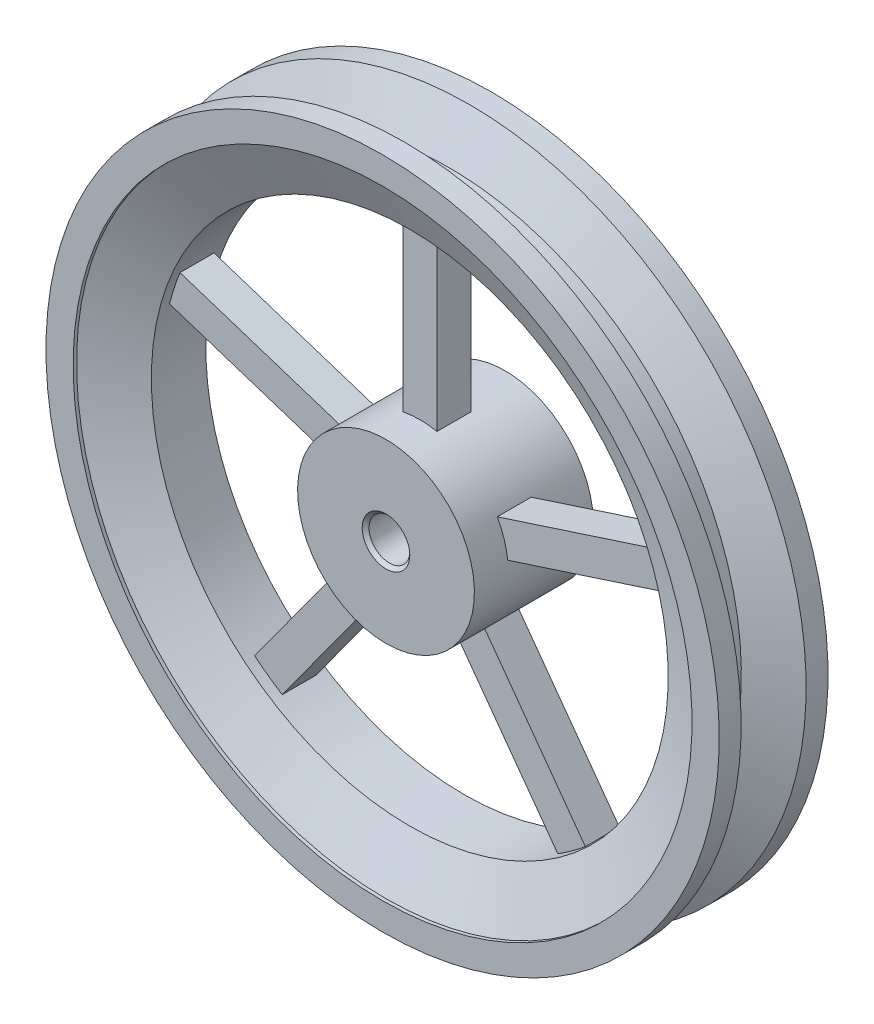
ISO-10303-21;
HEADER;
FILE_DESCRIPTION(('STEP AP214'),'2;1');
FILE_NAME('part.step','',(''),(''),'','','');
FILE_SCHEMA(('AUTOMOTIVE_DESIGN { 1 0 10303 214 1 1 1 1 }'));
ENDSEC;
DATA;
#1=APPLICATION_CONTEXT('core data for automotive mechanical design processes');
#2=APPLICATION_PROTOCOL_DEFINITION('international standard','automotive_design',2000,#1);
#3=PRODUCT_CONTEXT('',#1,'mechanical');
#4=PRODUCT('Part','Part','',(#3));
#5=PRODUCT_RELATED_PRODUCT_CATEGORY('part','',(#4));
#6=PRODUCT_DEFINITION_FORMATION('','',#4);
#7=PRODUCT_DEFINITION_CONTEXT('part definition',#1,'design');
#8=PRODUCT_DEFINITION('design','',#6,#7);
#9=PRODUCT_DEFINITION_SHAPE('','',#8);
#10=(LENGTH_UNIT() NAMED_UNIT(*) SI_UNIT(.MILLI.,.METRE.));
#11=(NAMED_UNIT(*) PLANE_ANGLE_UNIT() SI_UNIT($,.RADIAN.));
#12=(NAMED_UNIT(*) SI_UNIT($,.STERADIAN.) SOLID_ANGLE_UNIT());
#13=UNCERTAINTY_MEASURE_WITH_UNIT(LENGTH_MEASURE(1.E-05),#10,'distance_accuracy_value','');
#14=(GEOMETRIC_REPRESENTATION_CONTEXT(3) GLOBAL_UNCERTAINTY_ASSIGNED_CONTEXT((#13)) GLOBAL_UNIT_ASSIGNED_CONTEXT((#10,
#11,#12)) REPRESENTATION_CONTEXT('',''));
#15=CARTESIAN_POINT('',(0.,0.,0.));
#16=DIRECTION('',(0.,0.,1.));
#17=DIRECTION('',(1.,0.,0.));
#18=AXIS2_PLACEMENT_3D('',#15,#16,#17);
#19=CARTESIAN_POINT('',(0.,140.,10.));
#20=DIRECTION('',(0.,0.,-1.));
#21=DIRECTION('',(0.,1.,0.));
#22=AXIS2_PLACEMENT_3D('',#19,#20,#21);
#23=PLANE('',#22);
#24=DIRECTION('',(0.,1.,0.));
#25=VECTOR('',#24,1.);
#26=CARTESIAN_POINT('',(-10.0000000000001,0.,10.));
#27=LINE('',#26,#25);
#28=CARTESIAN_POINT('',(-10.0000000000001,39.0294032886923,10.));
#29=VERTEX_POINT('',#28);
#30=CARTESIAN_POINT('',(-10.0000000000001,139.670695917174,10.));
#31=VERTEX_POINT('',#30);
#32=EDGE_CURVE('E355',#29,#31,#27,.T.);
#33=ORIENTED_EDGE('',*,*,#32,.F.);
#34=CARTESIAN_POINT('',(0.,-12.,10.));
#35=DIRECTION('',(0.,0.,1.));
#36=DIRECTION('',(0.,-1.,0.));
#37=AXIS2_PLACEMENT_3D('',#34,#35,#36);
#38=CIRCLE('',#37,52.);
#39=CARTESIAN_POINT('',(9.99999999999993,39.0294032886923,10.));
#40=VERTEX_POINT('',#39);
#41=EDGE_CURVE('E344',#40,#29,#38,.T.);
#42=ORIENTED_EDGE('',*,*,#41,.F.);
#43=DIRECTION('',(0.,1.,0.));
#44=VECTOR('',#43,1.);
#45=CARTESIAN_POINT('',(9.99999999999993,0.,10.));
#46=LINE('',#45,#44);
#47=CARTESIAN_POINT('',(9.99999999999993,139.670695917174,9.99999999999999));
#48=VERTEX_POINT('',#47);
#49=EDGE_CURVE('E369',#40,#48,#46,.T.);
#50=ORIENTED_EDGE('',*,*,#49,.T.);
#51=CARTESIAN_POINT('',(0.,-12.,9.99999999999999));
#52=DIRECTION('',(0.,0.,1.));
#53=DIRECTION('',(0.,-1.,0.));
#54=AXIS2_PLACEMENT_3D('',#51,#52,#53);
#55=CIRCLE('',#54,152.);
#56=EDGE_CURVE('E572',#48,#31,#55,.T.);
#57=ORIENTED_EDGE('',*,*,#56,.T.);
#58=EDGE_LOOP('',(#33,#42,#50,#57));
#59=FACE_BOUND('',#58,.T.);
#60=ADVANCED_FACE('F139',(#59),#23,.F.);
#61=DIRECTION('',(0.951056516295154,0.309016994374945,0.));
#62=VECTOR('',#61,1.);
#63=CARTESIAN_POINT('',(0.436541570005119,-1.34353680329741,10.));
#64=LINE('',#63,#62);
#65=CARTESIAN_POINT('',(45.4416765766144,13.2795179919709,10.));
#66=VERTEX_POINT('',#65);
#67=CARTESIAN_POINT('',(141.1572337393,44.3793877500338,10.));
#68=VERTEX_POINT('',#67);
#69=EDGE_CURVE('E372',#66,#68,#64,.T.);
#70=ORIENTED_EDGE('',*,*,#69,.F.);
#71=CARTESIAN_POINT('',(51.6220164641136,-5.74161233393213,10.));
#72=VERTEX_POINT('',#71);
#73=EDGE_CURVE('E412',#72,#66,#38,.T.);
#74=ORIENTED_EDGE('',*,*,#73,.F.);
#75=DIRECTION('',(0.951056516295155,0.309016994374945,0.));
#76=VECTOR('',#75,1.);
#77=CARTESIAN_POINT('',(6.61688145750401,-20.3646671292005,10.));
#78=LINE('',#77,#76);
#79=CARTESIAN_POINT('',(147.337573626799,25.3582574241307,9.99999999999999));
#80=VERTEX_POINT('',#79);
#81=EDGE_CURVE('E513',#72,#80,#78,.T.);
#82=ORIENTED_EDGE('',*,*,#81,.T.);
#83=EDGE_CURVE('E573',#80,#68,#55,.T.);
#84=ORIENTED_EDGE('',*,*,#83,.T.);
#85=EDGE_LOOP('',(#70,#74,#82,#84));
#86=FACE_BOUND('',#85,.T.);
#87=ADVANCED_FACE('F467',(#86),#23,.F.);
#88=DIRECTION('',(-0.58778525229248,-0.809016994374942,0.));
#89=VECTOR('',#88,1.);
#90=CARTESIAN_POINT('',(13.7965090415227,-10.0237505566769,10.));
#91=LINE('',#90,#89);
#92=CARTESIAN_POINT('',(-21.9041607426266,-59.1615069962907,10.));
#93=VERTEX_POINT('',#92);
#94=CARTESIAN_POINT('',(-81.0596283213006,-140.582023068595,10.));
#95=VERTEX_POINT('',#94);
#96=EDGE_CURVE('E503',#93,#95,#91,.T.);
#97=ORIENTED_EDGE('',*,*,#96,.F.);
#98=CARTESIAN_POINT('',(-38.0845006301262,-47.405801950442,10.));
#99=VERTEX_POINT('',#98);
#100=EDGE_CURVE('E285',#99,#93,#38,.T.);
#101=ORIENTED_EDGE('',*,*,#100,.F.);
#102=DIRECTION('',(-0.58778525229248,-0.809016994374942,0.));
#103=VECTOR('',#102,1.);
#104=CARTESIAN_POINT('',(-2.38383084597611,1.73195448917268,10.));
#105=LINE('',#104,#103);
#106=CARTESIAN_POINT('',(-97.2399682087997,-128.826318022745,9.99999999999999));
#107=VERTEX_POINT('',#106);
#108=EDGE_CURVE('E385',#99,#107,#105,.T.);
#109=ORIENTED_EDGE('',*,*,#108,.T.);
#110=EDGE_CURVE('E567',#107,#95,#55,.T.);
#111=ORIENTED_EDGE('',*,*,#110,.T.);
#112=EDGE_LOOP('',(#97,#101,#109,#111));
#113=FACE_BOUND('',#112,.T.);
#114=ADVANCED_FACE('F473',(#113),#23,.F.);
#115=CARTESIAN_POINT('',(21.904160742631,-59.1615069962887,10.));
#116=VERTEX_POINT('',#115);
#117=CARTESIAN_POINT('',(38.0845006301294,-47.4058019504385,10.));
#118=VERTEX_POINT('',#117);
#119=EDGE_CURVE('E414',#116,#118,#38,.T.);
#120=ORIENTED_EDGE('',*,*,#119,.F.);
#121=DIRECTION('',(0.587785252292469,-0.809016994374951,0.));
#122=VECTOR('',#121,1.);
#123=CARTESIAN_POINT('',(-13.7965090415184,-10.0237505566734,10.));
#124=LINE('',#123,#122);
#125=CARTESIAN_POINT('',(81.0596283213033,-140.582023068593,9.99999999999999));
#126=VERTEX_POINT('',#125);
#127=EDGE_CURVE('E298',#116,#126,#124,.T.);
#128=ORIENTED_EDGE('',*,*,#127,.T.);
#129=CARTESIAN_POINT('',(97.2399682088022,-128.826318022743,10.));
#130=VERTEX_POINT('',#129);
#131=EDGE_CURVE('E413',#126,#130,#55,.T.);
#132=ORIENTED_EDGE('',*,*,#131,.T.);
#133=DIRECTION('',(0.587785252292469,-0.809016994374951,0.));
#134=VECTOR('',#133,1.);
#135=CARTESIAN_POINT('',(2.38383084598065,1.73195448917592,10.));
#136=LINE('',#135,#134);
#137=EDGE_CURVE('E494',#118,#130,#136,.T.);
#138=ORIENTED_EDGE('',*,*,#137,.F.);
#139=EDGE_LOOP('',(#120,#128,#132,#138));
#140=FACE_BOUND('',#139,.T.);
#141=ADVANCED_FACE('F476',(#140),#23,.F.);
#142=CARTESIAN_POINT('',(-45.4416765766151,13.2795179919696,10.));
#143=VERTEX_POINT('',#142);
#144=CARTESIAN_POINT('',(-51.6220164641137,-5.74161233393359,10.));
#145=VERTEX_POINT('',#144);
#146=EDGE_CURVE('E406',#143,#145,#38,.T.);
#147=ORIENTED_EDGE('',*,*,#146,.F.);
#148=DIRECTION('',(-0.95105651629515,0.309016994374958,0.));
#149=VECTOR('',#148,1.);
#150=CARTESIAN_POINT('',(-0.436541570005793,-1.34353680329942,10.));
#151=LINE('',#150,#149);
#152=CARTESIAN_POINT('',(-141.1572337393,44.3793877500337,10.));
#153=VERTEX_POINT('',#152);
#154=EDGE_CURVE('E359',#143,#153,#151,.T.);
#155=ORIENTED_EDGE('',*,*,#154,.T.);
#156=CARTESIAN_POINT('',(-147.337573626799,25.3582574241307,10.));
#157=VERTEX_POINT('',#156);
#158=EDGE_CURVE('E408',#153,#157,#55,.T.);
#159=ORIENTED_EDGE('',*,*,#158,.T.);
#160=DIRECTION('',(-0.95105651629515,0.309016994374958,0.));
#161=VECTOR('',#160,1.);
#162=CARTESIAN_POINT('',(-6.61688145750496,-20.3646671292024,10.));
#163=LINE('',#162,#161);
#164=EDGE_CURVE('E365',#145,#157,#163,.T.);
#165=ORIENTED_EDGE('',*,*,#164,.F.);
#166=EDGE_LOOP('',(#147,#155,#159,#165));
#167=FACE_BOUND('',#166,.T.);
#168=ADVANCED_FACE('F405',(#167),#23,.F.);
#169=CARTESIAN_POINT('',(0.,140.,-10.));
#170=DIRECTION('',(0.,0.,1.));
#171=DIRECTION('',(0.,-1.,0.));
#172=AXIS2_PLACEMENT_3D('',#169,#170,#171);
#173=PLANE('',#172);
#174=DIRECTION('',(-0.95105651629515,0.309016994374958,0.));
#175=VECTOR('',#174,1.);
#176=CARTESIAN_POINT('',(-0.436541570005793,-1.34353680329942,-10.));
#177=LINE('',#176,#175);
#178=CARTESIAN_POINT('',(-45.4416765766151,13.2795179919696,-10.));
#179=VERTEX_POINT('',#178);
#180=CARTESIAN_POINT('',(-141.1572337393,44.3793877500337,-10.));
#181=VERTEX_POINT('',#180);
#182=EDGE_CURVE('E352',#179,#181,#177,.T.);
#183=ORIENTED_EDGE('',*,*,#182,.F.);
#184=CARTESIAN_POINT('',(0.,-12.,-10.));
#185=DIRECTION('',(0.,0.,1.));
#186=DIRECTION('',(0.,-1.,0.));
#187=AXIS2_PLACEMENT_3D('',#184,#185,#186);
#188=CIRCLE('',#187,52.);
#189=CARTESIAN_POINT('',(-51.6220164641137,-5.74161233393359,-10.));
#190=VERTEX_POINT('',#189);
#191=EDGE_CURVE('E303',#179,#190,#188,.T.);
#192=ORIENTED_EDGE('',*,*,#191,.T.);
#193=DIRECTION('',(-0.95105651629515,0.309016994374958,0.));
#194=VECTOR('',#193,1.);
#195=CARTESIAN_POINT('',(-6.61688145750496,-20.3646671292024,-10.));
#196=LINE('',#195,#194);
#197=CARTESIAN_POINT('',(-147.337573626799,25.3582574241307,-10.));
#198=VERTEX_POINT('',#197);
#199=EDGE_CURVE('E382',#190,#198,#196,.T.);
#200=ORIENTED_EDGE('',*,*,#199,.T.);
#201=CARTESIAN_POINT('',(0.,-12.,-10.));
#202=DIRECTION('',(0.,0.,1.));
#203=DIRECTION('',(0.,-1.,0.));
#204=AXIS2_PLACEMENT_3D('',#201,#202,#203);
#205=CIRCLE('',#204,152.);
#206=EDGE_CURVE('E320',#181,#198,#205,.T.);
#207=ORIENTED_EDGE('',*,*,#206,.F.);
#208=EDGE_LOOP('',(#183,#192,#200,#207));
#209=FACE_BOUND('',#208,.T.);
#210=ADVANCED_FACE('F464',(#209),#173,.F.);
#211=CARTESIAN_POINT('',(9.99999999999993,39.0294032886923,-10.));
#212=VERTEX_POINT('',#211);
#213=CARTESIAN_POINT('',(-10.0000000000001,39.0294032886923,-10.));
#214=VERTEX_POINT('',#213);
#215=EDGE_CURVE('E308',#212,#214,#188,.T.);
#216=ORIENTED_EDGE('',*,*,#215,.T.);
#217=DIRECTION('',(0.,1.,0.));
#218=VECTOR('',#217,1.);
#219=CARTESIAN_POINT('',(-10.0000000000001,0.,-10.));
#220=LINE('',#219,#218);
#221=CARTESIAN_POINT('',(-10.0000000000001,139.670695917174,-10.));
#222=VERTEX_POINT('',#221);
#223=EDGE_CURVE('E335',#214,#222,#220,.T.);
#224=ORIENTED_EDGE('',*,*,#223,.T.);
#225=CARTESIAN_POINT('',(9.99999999999993,139.670695917174,-10.));
#226=VERTEX_POINT('',#225);
#227=EDGE_CURVE('E535',#226,#222,#205,.T.);
#228=ORIENTED_EDGE('',*,*,#227,.F.);
#229=DIRECTION('',(0.,1.,0.));
#230=VECTOR('',#229,1.);
#231=CARTESIAN_POINT('',(9.99999999999993,0.,-10.));
#232=LINE('',#231,#230);
#233=EDGE_CURVE('E337',#212,#226,#232,.T.);
#234=ORIENTED_EDGE('',*,*,#233,.F.);
#235=EDGE_LOOP('',(#216,#224,#228,#234));
#236=FACE_BOUND('',#235,.T.);
#237=ADVANCED_FACE('F332',(#236),#173,.F.);
#238=DIRECTION('',(0.587785252292469,-0.809016994374951,0.));
#239=VECTOR('',#238,1.);
#240=CARTESIAN_POINT('',(-13.7965090415184,-10.0237505566734,-10.));
#241=LINE('',#240,#239);
#242=CARTESIAN_POINT('',(21.904160742631,-59.1615069962887,-10.));
#243=VERTEX_POINT('',#242);
#244=CARTESIAN_POINT('',(81.0596283213033,-140.582023068593,-10.));
#245=VERTEX_POINT('',#244);
#246=EDGE_CURVE('E290',#243,#245,#241,.T.);
#247=ORIENTED_EDGE('',*,*,#246,.F.);
#248=CARTESIAN_POINT('',(38.0845006301294,-47.4058019504385,-10.));
#249=VERTEX_POINT('',#248);
#250=EDGE_CURVE('E306',#243,#249,#188,.T.);
#251=ORIENTED_EDGE('',*,*,#250,.T.);
#252=DIRECTION('',(0.587785252292469,-0.809016994374951,0.));
#253=VECTOR('',#252,1.);
#254=CARTESIAN_POINT('',(2.38383084598065,1.73195448917592,-10.));
#255=LINE('',#254,#253);
#256=CARTESIAN_POINT('',(97.2399682088022,-128.826318022743,-10.));
#257=VERTEX_POINT('',#256);
#258=EDGE_CURVE('E510',#249,#257,#255,.T.);
#259=ORIENTED_EDGE('',*,*,#258,.T.);
#260=EDGE_CURVE('E321',#245,#257,#205,.T.);
#261=ORIENTED_EDGE('',*,*,#260,.F.);
#262=EDGE_LOOP('',(#247,#251,#259,#261));
#263=FACE_BOUND('',#262,.T.);
#264=ADVANCED_FACE('F526',(#263),#173,.F.);
#265=CARTESIAN_POINT('',(51.6220164641136,-5.74161233393213,-10.));
#266=VERTEX_POINT('',#265);
#267=CARTESIAN_POINT('',(45.4416765766144,13.2795179919709,-10.));
#268=VERTEX_POINT('',#267);
#269=EDGE_CURVE('E315',#266,#268,#188,.T.);
#270=ORIENTED_EDGE('',*,*,#269,.T.);
#271=DIRECTION('',(0.951056516295154,0.309016994374945,0.));
#272=VECTOR('',#271,1.);
#273=CARTESIAN_POINT('',(0.436541570005119,-1.34353680329741,-10.));
#274=LINE('',#273,#272);
#275=CARTESIAN_POINT('',(141.1572337393,44.3793877500338,-10.));
#276=VERTEX_POINT('',#275);
#277=EDGE_CURVE('E367',#268,#276,#274,.T.);
#278=ORIENTED_EDGE('',*,*,#277,.T.);
#279=CARTESIAN_POINT('',(147.337573626799,25.3582574241307,-10.));
#280=VERTEX_POINT('',#279);
#281=EDGE_CURVE('E530',#280,#276,#205,.T.);
#282=ORIENTED_EDGE('',*,*,#281,.F.);
#283=DIRECTION('',(0.951056516295155,0.309016994374945,0.));
#284=VECTOR('',#283,1.);
#285=CARTESIAN_POINT('',(6.61688145750401,-20.3646671292005,-10.));
#286=LINE('',#285,#284);
#287=EDGE_CURVE('E512',#266,#280,#286,.T.);
#288=ORIENTED_EDGE('',*,*,#287,.F.);
#289=EDGE_LOOP('',(#270,#278,#282,#288));
#290=FACE_BOUND('',#289,.T.);
#291=ADVANCED_FACE('F462',(#290),#173,.F.);
#292=CARTESIAN_POINT('',(-38.0845006301262,-47.405801950442,-10.));
#293=VERTEX_POINT('',#292);
#294=CARTESIAN_POINT('',(-21.9041607426266,-59.1615069962907,-10.));
#295=VERTEX_POINT('',#294);
#296=EDGE_CURVE('E283',#293,#295,#188,.T.);
#297=ORIENTED_EDGE('',*,*,#296,.T.);
#298=DIRECTION('',(-0.58778525229248,-0.809016994374942,0.));
#299=VECTOR('',#298,1.);
#300=CARTESIAN_POINT('',(13.7965090415227,-10.0237505566769,-10.));
#301=LINE('',#300,#299);
#302=CARTESIAN_POINT('',(-81.0596283213006,-140.582023068595,-10.));
#303=VERTEX_POINT('',#302);
#304=EDGE_CURVE('E293',#295,#303,#301,.T.);
#305=ORIENTED_EDGE('',*,*,#304,.T.);
#306=CARTESIAN_POINT('',(-97.2399682087997,-128.826318022745,-10.));
#307=VERTEX_POINT('',#306);
#308=EDGE_CURVE('E314',#307,#303,#205,.T.);
#309=ORIENTED_EDGE('',*,*,#308,.F.);
#310=DIRECTION('',(-0.58778525229248,-0.809016994374942,0.));
#311=VECTOR('',#310,1.);
#312=CARTESIAN_POINT('',(-2.38383084597611,1.73195448917268,-10.));
#313=LINE('',#312,#311);
#314=EDGE_CURVE('E302',#293,#307,#313,.T.);
#315=ORIENTED_EDGE('',*,*,#314,.F.);
#316=EDGE_LOOP('',(#297,#305,#309,#315));
#317=FACE_BOUND('',#316,.T.);
#318=ADVANCED_FACE('F301',(#317),#173,.F.);
#319=CARTESIAN_POINT('',(0.,40.,30.));
#320=DIRECTION('',(0.,0.,-1.));
#321=DIRECTION('',(0.,1.,0.));
#322=AXIS2_PLACEMENT_3D('',#319,#320,#321);
#323=PLANE('',#322);
#324=CARTESIAN_POINT('',(0.,-12.,30.));
#325=DIRECTION('',(0.,0.,-1.));
#326=DIRECTION('',(0.,1.,0.));
#327=AXIS2_PLACEMENT_3D('',#324,#325,#326);
#328=CIRCLE('',#327,13.9999999999999);
#329=CARTESIAN_POINT('',(0.,1.99999999999988,30.));
#330=VERTEX_POINT('',#329);
#331=EDGE_CURVE('E12',#330,#330,#328,.T.);
#332=ORIENTED_EDGE('',*,*,#331,.T.);
#333=EDGE_LOOP('',(#332));
#334=FACE_BOUND('',#333,.T.);
#335=CARTESIAN_POINT('',(0.,-12.,30.));
#336=DIRECTION('',(0.,0.,1.));
#337=DIRECTION('',(0.,-1.,0.));
#338=AXIS2_PLACEMENT_3D('',#335,#336,#337);
#339=CIRCLE('',#338,52.);
#340=CARTESIAN_POINT('',(0.,-64.,30.));
#341=VERTEX_POINT('',#340);
#342=EDGE_CURVE('E418',#341,#341,#339,.T.);
#343=ORIENTED_EDGE('',*,*,#342,.T.);
#344=EDGE_LOOP('',(#343));
#345=FACE_BOUND('',#344,.T.);
#346=ADVANCED_FACE('F449',(#334,#345),#323,.F.);
#347=CARTESIAN_POINT('',(0.,-12.,30.));
#348=DIRECTION('',(0.,0.,1.));
#349=DIRECTION('',(0.,-1.,0.));
#350=AXIS2_PLACEMENT_3D('',#347,#348,#349);
#351=CONICAL_SURFACE('',#350,182.,1.13446401379631);
#352=CARTESIAN_POINT('',(0.,-12.,16.01077025535));
#353=DIRECTION('',(0.,0.,1.));
#354=DIRECTION('',(0.,-1.,0.));
#355=AXIS2_PLACEMENT_3D('',#352,#353,#354);
#356=CIRCLE('',#355,152.);
#357=CARTESIAN_POINT('',(0.,-164.,16.01077025535));
#358=VERTEX_POINT('',#357);
#359=EDGE_CURVE('E565',#358,#358,#356,.T.);
#360=ORIENTED_EDGE('',*,*,#359,.F.);
#361=EDGE_LOOP('',(#360));
#362=FACE_BOUND('',#361,.T.);
#363=CARTESIAN_POINT('',(0.,-12.,30.));
#364=DIRECTION('',(0.,0.,1.));
#365=DIRECTION('',(0.,-1.,0.));
#366=AXIS2_PLACEMENT_3D('',#363,#364,#365);
#367=CIRCLE('',#366,182.);
#368=CARTESIAN_POINT('',(0.,-194.,30.));
#369=VERTEX_POINT('',#368);
#370=EDGE_CURVE('E563',#369,#369,#367,.T.);
#371=ORIENTED_EDGE('',*,*,#370,.T.);
#372=EDGE_LOOP('',(#371));
#373=FACE_BOUND('',#372,.T.);
#374=ADVANCED_FACE('F451',(#362,#373),#351,.F.);
#375=CARTESIAN_POINT('',(0.,-12.,30.));
#376=DIRECTION('',(0.,0.,1.));
#377=DIRECTION('',(0.,-1.,0.));
#378=AXIS2_PLACEMENT_3D('',#375,#376,#377);
#379=CYLINDRICAL_SURFACE('',#378,182.);
#380=ORIENTED_EDGE('',*,*,#370,.F.);
#381=EDGE_LOOP('',(#380));
#382=FACE_BOUND('',#381,.T.);
#383=CARTESIAN_POINT('',(0.,-12.,32.));
#384=DIRECTION('',(0.,0.,1.));
#385=DIRECTION('',(0.,-1.,0.));
#386=AXIS2_PLACEMENT_3D('',#383,#384,#385);
#387=CIRCLE('',#386,182.);
#388=CARTESIAN_POINT('',(0.,-194.,32.));
#389=VERTEX_POINT('',#388);
#390=EDGE_CURVE('E560',#389,#389,#387,.T.);
#391=ORIENTED_EDGE('',*,*,#390,.T.);
#392=EDGE_LOOP('',(#391));
#393=FACE_BOUND('',#392,.T.);
#394=ADVANCED_FACE('F458',(#382,#393),#379,.F.);
#395=CARTESIAN_POINT('',(0.,186.,32.));
#396=DIRECTION('',(0.,0.,-1.));
#397=DIRECTION('',(0.,1.,0.));
#398=AXIS2_PLACEMENT_3D('',#395,#396,#397);
#399=PLANE('',#398);
#400=ORIENTED_EDGE('',*,*,#390,.F.);
#401=EDGE_LOOP('',(#400));
#402=FACE_BOUND('',#401,.T.);
#403=CARTESIAN_POINT('',(0.,-12.,32.));
#404=DIRECTION('',(0.,0.,1.));
#405=DIRECTION('',(0.,-1.,0.));
#406=AXIS2_PLACEMENT_3D('',#403,#404,#405);
#407=CIRCLE('',#406,198.);
#408=CARTESIAN_POINT('',(0.,-210.,32.));
#409=VERTEX_POINT('',#408);
#410=EDGE_CURVE('E557',#409,#409,#407,.T.);
#411=ORIENTED_EDGE('',*,*,#410,.T.);
#412=EDGE_LOOP('',(#411));
#413=FACE_BOUND('',#412,.T.);
#414=ADVANCED_FACE('F641',(#402,#413),#399,.F.);
#415=CARTESIAN_POINT('',(0.,-12.,30.));
#416=DIRECTION('',(0.,0.,1.));
#417=DIRECTION('',(0.,-1.,0.));
#418=AXIS2_PLACEMENT_3D('',#415,#416,#417);
#419=CYLINDRICAL_SURFACE('',#418,198.);
#420=ORIENTED_EDGE('',*,*,#410,.F.);
#421=EDGE_LOOP('',(#420));
#422=FACE_BOUND('',#421,.T.);
#423=CARTESIAN_POINT('',(0.,-12.,19.1239991120299));
#424=DIRECTION('',(0.,0.,1.));
#425=DIRECTION('',(0.,-1.,0.));
#426=AXIS2_PLACEMENT_3D('',#423,#424,#425);
#427=CIRCLE('',#426,198.);
#428=CARTESIAN_POINT('',(0.,-210.,19.1239991120299));
#429=VERTEX_POINT('',#428);
#430=EDGE_CURVE('E554',#429,#429,#427,.T.);
#431=ORIENTED_EDGE('',*,*,#430,.T.);
#432=EDGE_LOOP('',(#431));
#433=FACE_BOUND('',#432,.T.);
#434=ADVANCED_FACE('F637',(#422,#433),#419,.T.);
#435=CARTESIAN_POINT('',(0.,-12.,6.99999999999998));
#436=DIRECTION('',(0.,0.,1.));
#437=DIRECTION('',(0.,-1.,0.));
#438=AXIS2_PLACEMENT_3D('',#435,#436,#437);
#439=CONICAL_SURFACE('',#438,172.,1.13446401379631);
#440=ORIENTED_EDGE('',*,*,#430,.F.);
#441=EDGE_LOOP('',(#440));
#442=FACE_BOUND('',#441,.T.);
#443=CARTESIAN_POINT('',(0.,-12.,6.99999999999998));
#444=DIRECTION('',(0.,0.,1.));
#445=DIRECTION('',(0.,-1.,0.));
#446=AXIS2_PLACEMENT_3D('',#443,#444,#445);
#447=CIRCLE('',#446,172.);
#448=CARTESIAN_POINT('',(0.,-184.,6.99999999999996));
#449=VERTEX_POINT('',#448);
#450=EDGE_CURVE('E551',#449,#449,#447,.T.);
#451=ORIENTED_EDGE('',*,*,#450,.T.);
#452=EDGE_LOOP('',(#451));
#453=FACE_BOUND('',#452,.T.);
#454=ADVANCED_FACE('F633',(#442,#453),#439,.T.);
#455=CARTESIAN_POINT('',(0.,-12.,30.));
#456=DIRECTION('',(0.,0.,1.));
#457=DIRECTION('',(0.,-1.,0.));
#458=AXIS2_PLACEMENT_3D('',#455,#456,#457);
#459=CYLINDRICAL_SURFACE('',#458,172.);
#460=ORIENTED_EDGE('',*,*,#450,.F.);
#461=EDGE_LOOP('',(#460));
#462=FACE_BOUND('',#461,.T.);
#463=CARTESIAN_POINT('',(0.,-12.,-7.00000000000001));
#464=DIRECTION('',(0.,0.,1.));
#465=DIRECTION('',(0.,-1.,0.));
#466=AXIS2_PLACEMENT_3D('',#463,#464,#465);
#467=CIRCLE('',#466,172.);
#468=CARTESIAN_POINT('',(0.,-184.,-7.00000000000003));
#469=VERTEX_POINT('',#468);
#470=EDGE_CURVE('E548',#469,#469,#467,.T.);
#471=ORIENTED_EDGE('',*,*,#470,.T.);
#472=EDGE_LOOP('',(#471));
#473=FACE_BOUND('',#472,.T.);
#474=ADVANCED_FACE('F629',(#462,#473),#459,.T.);
#475=CARTESIAN_POINT('',(0.,-12.,-19.12399911203));
#476=DIRECTION('',(0.,0.,-1.));
#477=DIRECTION('',(0.,1.,0.));
#478=AXIS2_PLACEMENT_3D('',#475,#476,#477);
#479=CONICAL_SURFACE('',#478,198.,1.13446401379631);
#480=ORIENTED_EDGE('',*,*,#470,.F.);
#481=EDGE_LOOP('',(#480));
#482=FACE_BOUND('',#481,.T.);
#483=CARTESIAN_POINT('',(0.,-12.,-19.12399911203));
#484=DIRECTION('',(0.,0.,1.));
#485=DIRECTION('',(0.,-1.,0.));
#486=AXIS2_PLACEMENT_3D('',#483,#484,#485);
#487=CIRCLE('',#486,198.);
#488=CARTESIAN_POINT('',(0.,-210.,-19.12399911203));
#489=VERTEX_POINT('',#488);
#490=EDGE_CURVE('E545',#489,#489,#487,.T.);
#491=ORIENTED_EDGE('',*,*,#490,.T.);
#492=EDGE_LOOP('',(#491));
#493=FACE_BOUND('',#492,.T.);
#494=ADVANCED_FACE('F625',(#482,#493),#479,.T.);
#495=CARTESIAN_POINT('',(0.,-12.,30.));
#496=DIRECTION('',(0.,0.,1.));
#497=DIRECTION('',(0.,-1.,0.));
#498=AXIS2_PLACEMENT_3D('',#495,#496,#497);
#499=CYLINDRICAL_SURFACE('',#498,198.);
#500=ORIENTED_EDGE('',*,*,#490,.F.);
#501=EDGE_LOOP('',(#500));
#502=FACE_BOUND('',#501,.T.);
#503=CARTESIAN_POINT('',(0.,-12.,-32.));
#504=DIRECTION('',(0.,0.,1.));
#505=DIRECTION('',(0.,-1.,0.));
#506=AXIS2_PLACEMENT_3D('',#503,#504,#505);
#507=CIRCLE('',#506,198.);
#508=CARTESIAN_POINT('',(0.,-210.,-32.));
#509=VERTEX_POINT('',#508);
#510=EDGE_CURVE('E542',#509,#509,#507,.T.);
#511=ORIENTED_EDGE('',*,*,#510,.T.);
#512=EDGE_LOOP('',(#511));
#513=FACE_BOUND('',#512,.T.);
#514=ADVANCED_FACE('F621',(#502,#513),#499,.T.);
#515=CARTESIAN_POINT('',(0.,186.,-32.));
#516=DIRECTION('',(0.,0.,1.));
#517=DIRECTION('',(0.,-1.,0.));
#518=AXIS2_PLACEMENT_3D('',#515,#516,#517);
#519=PLANE('',#518);
#520=ORIENTED_EDGE('',*,*,#510,.F.);
#521=EDGE_LOOP('',(#520));
#522=FACE_BOUND('',#521,.T.);
#523=CARTESIAN_POINT('',(0.,-12.,-32.));
#524=DIRECTION('',(0.,0.,1.));
#525=DIRECTION('',(0.,-1.,0.));
#526=AXIS2_PLACEMENT_3D('',#523,#524,#525);
#527=CIRCLE('',#526,182.);
#528=CARTESIAN_POINT('',(0.,-194.,-32.));
#529=VERTEX_POINT('',#528);
#530=EDGE_CURVE('E539',#529,#529,#527,.T.);
#531=ORIENTED_EDGE('',*,*,#530,.T.);
#532=EDGE_LOOP('',(#531));
#533=FACE_BOUND('',#532,.T.);
#534=ADVANCED_FACE('F617',(#522,#533),#519,.F.);
#535=CARTESIAN_POINT('',(0.,-12.,30.));
#536=DIRECTION('',(0.,0.,1.));
#537=DIRECTION('',(0.,-1.,0.));
#538=AXIS2_PLACEMENT_3D('',#535,#536,#537);
#539=CYLINDRICAL_SURFACE('',#538,182.);
#540=ORIENTED_EDGE('',*,*,#530,.F.);
#541=EDGE_LOOP('',(#540));
#542=FACE_BOUND('',#541,.T.);
#543=CARTESIAN_POINT('',(0.,-12.,-30.));
#544=DIRECTION('',(0.,0.,1.));
#545=DIRECTION('',(0.,-1.,0.));
#546=AXIS2_PLACEMENT_3D('',#543,#544,#545);
#547=CIRCLE('',#546,182.);
#548=CARTESIAN_POINT('',(0.,-194.,-30.));
#549=VERTEX_POINT('',#548);
#550=EDGE_CURVE('E532',#549,#549,#547,.T.);
#551=ORIENTED_EDGE('',*,*,#550,.T.);
#552=EDGE_LOOP('',(#551));
#553=FACE_BOUND('',#552,.T.);
#554=ADVANCED_FACE('F613',(#542,#553),#539,.F.);
#555=CARTESIAN_POINT('',(0.,-12.,-16.0107702553501));
#556=DIRECTION('',(0.,0.,-1.));
#557=DIRECTION('',(0.,1.,0.));
#558=AXIS2_PLACEMENT_3D('',#555,#556,#557);
#559=CONICAL_SURFACE('',#558,152.,1.13446401379631);
#560=ORIENTED_EDGE('',*,*,#550,.F.);
#561=EDGE_LOOP('',(#560));
#562=FACE_BOUND('',#561,.T.);
#563=CARTESIAN_POINT('',(0.,-12.,-16.0107702553501));
#564=DIRECTION('',(0.,0.,1.));
#565=DIRECTION('',(0.,-1.,0.));
#566=AXIS2_PLACEMENT_3D('',#563,#564,#565);
#567=CIRCLE('',#566,152.);
#568=CARTESIAN_POINT('',(0.,-164.,-16.0107702553501));
#569=VERTEX_POINT('',#568);
#570=EDGE_CURVE('E529',#569,#569,#567,.T.);
#571=ORIENTED_EDGE('',*,*,#570,.T.);
#572=EDGE_LOOP('',(#571));
#573=FACE_BOUND('',#572,.T.);
#574=ADVANCED_FACE('F611',(#562,#573),#559,.F.);
#575=CARTESIAN_POINT('',(0.,-12.,30.));
#576=DIRECTION('',(0.,0.,1.));
#577=DIRECTION('',(0.,-1.,0.));
#578=AXIS2_PLACEMENT_3D('',#575,#576,#577);
#579=CYLINDRICAL_SURFACE('',#578,152.);
#580=ORIENTED_EDGE('',*,*,#158,.F.);
#581=DIRECTION('',(0.,0.,1.));
#582=VECTOR('',#581,1.);
#583=CARTESIAN_POINT('',(-141.1572337393,44.3793877500337,-10.));
#584=LINE('',#583,#582);
#585=EDGE_CURVE('E363',#181,#153,#584,.T.);
#586=ORIENTED_EDGE('',*,*,#585,.F.);
#587=ORIENTED_EDGE('',*,*,#206,.T.);
#588=DIRECTION('',(0.,0.,1.));
#589=VECTOR('',#588,1.);
#590=CARTESIAN_POINT('',(-147.337573626799,25.3582574241307,-10.));
#591=LINE('',#590,#589);
#592=EDGE_CURVE('E393',#198,#157,#591,.T.);
#593=ORIENTED_EDGE('',*,*,#592,.T.);
#594=EDGE_LOOP('',(#580,#586,#587,#593));
#595=FACE_BOUND('',#594,.T.);
#596=ORIENTED_EDGE('',*,*,#56,.F.);
#597=DIRECTION('',(0.,0.,1.));
#598=VECTOR('',#597,1.);
#599=CARTESIAN_POINT('',(9.99999999999993,139.670695917174,-10.));
#600=LINE('',#599,#598);
#601=EDGE_CURVE('E162',#226,#48,#600,.T.);
#602=ORIENTED_EDGE('',*,*,#601,.F.);
#603=ORIENTED_EDGE('',*,*,#227,.T.);
#604=DIRECTION('',(0.,0.,1.));
#605=VECTOR('',#604,1.);
#606=CARTESIAN_POINT('',(-10.0000000000001,139.670695917174,-10.));
#607=LINE('',#606,#605);
#608=EDGE_CURVE('E348',#222,#31,#607,.T.);
#609=ORIENTED_EDGE('',*,*,#608,.T.);
#610=EDGE_LOOP('',(#596,#602,#603,#609));
#611=FACE_BOUND('',#610,.T.);
#612=ORIENTED_EDGE('',*,*,#131,.F.);
#613=DIRECTION('',(0.,0.,1.));
#614=VECTOR('',#613,1.);
#615=CARTESIAN_POINT('',(81.0596283213033,-140.582023068593,-10.));
#616=LINE('',#615,#614);
#617=EDGE_CURVE('E499',#245,#126,#616,.T.);
#618=ORIENTED_EDGE('',*,*,#617,.F.);
#619=ORIENTED_EDGE('',*,*,#260,.T.);
#620=DIRECTION('',(0.,0.,1.));
#621=VECTOR('',#620,1.);
#622=CARTESIAN_POINT('',(97.2399682088022,-128.826318022743,-10.));
#623=LINE('',#622,#621);
#624=EDGE_CURVE('E521',#257,#130,#623,.T.);
#625=ORIENTED_EDGE('',*,*,#624,.T.);
#626=EDGE_LOOP('',(#612,#618,#619,#625));
#627=FACE_BOUND('',#626,.T.);
#628=ORIENTED_EDGE('',*,*,#83,.F.);
#629=DIRECTION('',(0.,0.,1.));
#630=VECTOR('',#629,1.);
#631=CARTESIAN_POINT('',(147.337573626799,25.3582574241307,-10.));
#632=LINE('',#631,#630);
#633=EDGE_CURVE('E519',#280,#80,#632,.T.);
#634=ORIENTED_EDGE('',*,*,#633,.F.);
#635=ORIENTED_EDGE('',*,*,#281,.T.);
#636=DIRECTION('',(0.,0.,1.));
#637=VECTOR('',#636,1.);
#638=CARTESIAN_POINT('',(141.1572337393,44.3793877500338,-10.));
#639=LINE('',#638,#637);
#640=EDGE_CURVE('E379',#276,#68,#639,.T.);
#641=ORIENTED_EDGE('',*,*,#640,.T.);
#642=EDGE_LOOP('',(#628,#634,#635,#641));
#643=FACE_BOUND('',#642,.T.);
#644=ORIENTED_EDGE('',*,*,#570,.F.);
#645=EDGE_LOOP('',(#644));
#646=FACE_BOUND('',#645,.T.);
#647=DIRECTION('',(0.,0.,1.));
#648=VECTOR('',#647,1.);
#649=CARTESIAN_POINT('',(-81.0596283213006,-140.582023068595,-10.));
#650=LINE('',#649,#648);
#651=EDGE_CURVE('E289',#303,#95,#650,.T.);
#652=ORIENTED_EDGE('',*,*,#651,.T.);
#653=ORIENTED_EDGE('',*,*,#110,.F.);
#654=DIRECTION('',(0.,0.,1.));
#655=VECTOR('',#654,1.);
#656=CARTESIAN_POINT('',(-97.2399682087997,-128.826318022745,-10.));
#657=LINE('',#656,#655);
#658=EDGE_CURVE('E154',#307,#107,#657,.T.);
#659=ORIENTED_EDGE('',*,*,#658,.F.);
#660=ORIENTED_EDGE('',*,*,#308,.T.);
#661=EDGE_LOOP('',(#652,#653,#659,#660));
#662=FACE_BOUND('',#661,.T.);
#663=ORIENTED_EDGE('',*,*,#359,.T.);
#664=EDGE_LOOP('',(#663));
#665=FACE_BOUND('',#664,.T.);
#666=ADVANCED_FACE('F445',(#595,#611,#627,#643,#646,#662,#665),#579,.F.);
#667=CARTESIAN_POINT('',(0.,-12.,30.));
#668=DIRECTION('',(0.,0.,1.));
#669=DIRECTION('',(0.,-1.,0.));
#670=AXIS2_PLACEMENT_3D('',#667,#668,#669);
#671=CYLINDRICAL_SURFACE('',#670,52.);
#672=ORIENTED_EDGE('',*,*,#41,.T.);
#673=DIRECTION('',(0.,0.,1.));
#674=VECTOR('',#673,1.);
#675=CARTESIAN_POINT('',(-10.0000000000001,39.0294032886923,-10.));
#676=LINE('',#675,#674);
#677=EDGE_CURVE('E342',#214,#29,#676,.T.);
#678=ORIENTED_EDGE('',*,*,#677,.F.);
#679=ORIENTED_EDGE('',*,*,#215,.F.);
#680=DIRECTION('',(0.,0.,1.));
#681=VECTOR('',#680,1.);
#682=CARTESIAN_POINT('',(9.99999999999993,39.0294032886923,-10.));
#683=LINE('',#682,#681);
#684=EDGE_CURVE('E341',#212,#40,#683,.T.);
#685=ORIENTED_EDGE('',*,*,#684,.T.);
#686=EDGE_LOOP('',(#672,#678,#679,#685));
#687=FACE_BOUND('',#686,.T.);
#688=ORIENTED_EDGE('',*,*,#73,.T.);
#689=DIRECTION('',(0.,0.,1.));
#690=VECTOR('',#689,1.);
#691=CARTESIAN_POINT('',(45.4416765766144,13.2795179919709,-10.));
#692=LINE('',#691,#690);
#693=EDGE_CURVE('E371',#268,#66,#692,.T.);
#694=ORIENTED_EDGE('',*,*,#693,.F.);
#695=ORIENTED_EDGE('',*,*,#269,.F.);
#696=DIRECTION('',(0.,0.,1.));
#697=VECTOR('',#696,1.);
#698=CARTESIAN_POINT('',(51.6220164641136,-5.74161233393213,-10.));
#699=LINE('',#698,#697);
#700=EDGE_CURVE('E375',#266,#72,#699,.T.);
#701=ORIENTED_EDGE('',*,*,#700,.T.);
#702=EDGE_LOOP('',(#688,#694,#695,#701));
#703=FACE_BOUND('',#702,.T.);
#704=ORIENTED_EDGE('',*,*,#100,.T.);
#705=DIRECTION('',(0.,0.,1.));
#706=VECTOR('',#705,1.);
#707=CARTESIAN_POINT('',(-21.9041607426266,-59.1615069962907,-10.));
#708=LINE('',#707,#706);
#709=EDGE_CURVE('E278',#295,#93,#708,.T.);
#710=ORIENTED_EDGE('',*,*,#709,.F.);
#711=ORIENTED_EDGE('',*,*,#296,.F.);
#712=DIRECTION('',(0.,0.,1.));
#713=VECTOR('',#712,1.);
#714=CARTESIAN_POINT('',(-38.0845006301262,-47.405801950442,-10.));
#715=LINE('',#714,#713);
#716=EDGE_CURVE('E310',#293,#99,#715,.T.);
#717=ORIENTED_EDGE('',*,*,#716,.T.);
#718=EDGE_LOOP('',(#704,#710,#711,#717));
#719=FACE_BOUND('',#718,.T.);
#720=ORIENTED_EDGE('',*,*,#119,.T.);
#721=DIRECTION('',(0.,0.,1.));
#722=VECTOR('',#721,1.);
#723=CARTESIAN_POINT('',(38.0845006301294,-47.4058019504385,-10.));
#724=LINE('',#723,#722);
#725=EDGE_CURVE('E495',#249,#118,#724,.T.);
#726=ORIENTED_EDGE('',*,*,#725,.F.);
#727=ORIENTED_EDGE('',*,*,#250,.F.);
#728=DIRECTION('',(0.,0.,1.));
#729=VECTOR('',#728,1.);
#730=CARTESIAN_POINT('',(21.904160742631,-59.1615069962887,-10.));
#731=LINE('',#730,#729);
#732=EDGE_CURVE('E497',#243,#116,#731,.T.);
#733=ORIENTED_EDGE('',*,*,#732,.T.);
#734=EDGE_LOOP('',(#720,#726,#727,#733));
#735=FACE_BOUND('',#734,.T.);
#736=DIRECTION('',(0.,0.,1.));
#737=VECTOR('',#736,1.);
#738=CARTESIAN_POINT('',(-45.4416765766151,13.2795179919696,-10.));
#739=LINE('',#738,#737);
#740=EDGE_CURVE('E349',#179,#143,#739,.T.);
#741=ORIENTED_EDGE('',*,*,#740,.T.);
#742=ORIENTED_EDGE('',*,*,#146,.T.);
#743=DIRECTION('',(0.,0.,1.));
#744=VECTOR('',#743,1.);
#745=CARTESIAN_POINT('',(-51.6220164641137,-5.74161233393359,-10.));
#746=LINE('',#745,#744);
#747=EDGE_CURVE('E387',#190,#145,#746,.T.);
#748=ORIENTED_EDGE('',*,*,#747,.F.);
#749=ORIENTED_EDGE('',*,*,#191,.F.);
#750=EDGE_LOOP('',(#741,#742,#748,#749));
#751=FACE_BOUND('',#750,.T.);
#752=CARTESIAN_POINT('',(0.,-12.,-40.));
#753=DIRECTION('',(0.,0.,1.));
#754=DIRECTION('',(0.,-1.,0.));
#755=AXIS2_PLACEMENT_3D('',#752,#753,#754);
#756=CIRCLE('',#755,52.);
#757=CARTESIAN_POINT('',(0.,-64.,-40.));
#758=VERTEX_POINT('',#757);
#759=EDGE_CURVE('E304',#758,#758,#756,.T.);
#760=ORIENTED_EDGE('',*,*,#759,.T.);
#761=EDGE_LOOP('',(#760));
#762=FACE_BOUND('',#761,.T.);
#763=ORIENTED_EDGE('',*,*,#342,.F.);
#764=EDGE_LOOP('',(#763));
#765=FACE_BOUND('',#764,.T.);
#766=ADVANCED_FACE('F280',(#687,#703,#719,#735,#751,#762,#765),#671,.T.);
#767=CARTESIAN_POINT('',(0.,40.,-40.));
#768=DIRECTION('',(0.,0.,1.));
#769=DIRECTION('',(0.,-1.,0.));
#770=AXIS2_PLACEMENT_3D('',#767,#768,#769);
#771=PLANE('',#770);
#772=CARTESIAN_POINT('',(0.,-12.,-40.));
#773=DIRECTION('',(0.,0.,1.));
#774=DIRECTION('',(0.,-1.,0.));
#775=AXIS2_PLACEMENT_3D('',#772,#773,#774);
#776=CIRCLE('',#775,14.);
#777=CARTESIAN_POINT('',(0.,-26.,-40.));
#778=VERTEX_POINT('',#777);
#779=EDGE_CURVE('E422',#778,#778,#776,.T.);
#780=ORIENTED_EDGE('',*,*,#779,.T.);
#781=EDGE_LOOP('',(#780));
#782=FACE_BOUND('',#781,.T.);
#783=ORIENTED_EDGE('',*,*,#759,.F.);
#784=EDGE_LOOP('',(#783));
#785=FACE_BOUND('',#784,.T.);
#786=ADVANCED_FACE('F438',(#782,#785),#771,.F.);
#787=CARTESIAN_POINT('',(0.,-12.,30.));
#788=DIRECTION('',(0.,0.,1.));
#789=DIRECTION('',(0.,-1.,0.));
#790=AXIS2_PLACEMENT_3D('',#787,#788,#789);
#791=CYLINDRICAL_SURFACE('',#790,12.);
#792=CARTESIAN_POINT('',(0.,-12.,-38.));
#793=DIRECTION('',(0.,0.,1.));
#794=DIRECTION('',(1.,0.,0.));
#795=AXIS2_PLACEMENT_3D('',#792,#793,#794);
#796=CIRCLE('',#795,12.);
#797=CARTESIAN_POINT('',(12.,-12.,-38.));
#798=VERTEX_POINT('',#797);
#799=EDGE_CURVE('E147',#798,#798,#796,.F.);
#800=ORIENTED_EDGE('',*,*,#799,.T.);
#801=EDGE_LOOP('',(#800));
#802=FACE_BOUND('',#801,.T.);
#803=CARTESIAN_POINT('',(0.,-12.,28.0000000000001));
#804=DIRECTION('',(0.,0.,-1.));
#805=DIRECTION('',(-1.,0.,0.));
#806=AXIS2_PLACEMENT_3D('',#803,#804,#805);
#807=CIRCLE('',#806,12.);
#808=CARTESIAN_POINT('',(-12.,-12.,28.0000000000001));
#809=VERTEX_POINT('',#808);
#810=EDGE_CURVE('E425',#809,#809,#807,.F.);
#811=ORIENTED_EDGE('',*,*,#810,.T.);
#812=EDGE_LOOP('',(#811));
#813=FACE_BOUND('',#812,.T.);
#814=ADVANCED_FACE('F430',(#802,#813),#791,.F.);
#815=CARTESIAN_POINT('',(-2.38383084597611,1.73195448917268,-10.));
#816=DIRECTION('',(-0.809016994374942,0.58778525229248,0.));
#817=DIRECTION('',(-0.58778525229248,-0.809016994374942,0.));
#818=AXIS2_PLACEMENT_3D('',#815,#816,#817);
#819=PLANE('',#818);
#820=ORIENTED_EDGE('',*,*,#108,.F.);
#821=ORIENTED_EDGE('',*,*,#716,.F.);
#822=ORIENTED_EDGE('',*,*,#314,.T.);
#823=ORIENTED_EDGE('',*,*,#658,.T.);
#824=EDGE_LOOP('',(#820,#821,#822,#823));
#825=FACE_BOUND('',#824,.T.);
#826=ADVANCED_FACE('F601',(#825),#819,.T.);
#827=CARTESIAN_POINT('',(-6.61688145750496,-20.3646671292024,-10.));
#828=DIRECTION('',(0.309016994374958,0.95105651629515,0.));
#829=DIRECTION('',(-0.95105651629515,0.309016994374958,0.));
#830=AXIS2_PLACEMENT_3D('',#827,#828,#829);
#831=PLANE('',#830);
#832=ORIENTED_EDGE('',*,*,#164,.T.);
#833=ORIENTED_EDGE('',*,*,#592,.F.);
#834=ORIENTED_EDGE('',*,*,#199,.F.);
#835=ORIENTED_EDGE('',*,*,#747,.T.);
#836=EDGE_LOOP('',(#832,#833,#834,#835));
#837=FACE_BOUND('',#836,.T.);
#838=ADVANCED_FACE('F398',(#837),#831,.F.);
#839=CARTESIAN_POINT('',(6.61688145750401,-20.3646671292005,-10.));
#840=DIRECTION('',(0.309016994374945,-0.951056516295155,0.));
#841=DIRECTION('',(0.951056516295155,0.309016994374945,0.));
#842=AXIS2_PLACEMENT_3D('',#839,#840,#841);
#843=PLANE('',#842);
#844=ORIENTED_EDGE('',*,*,#81,.F.);
#845=ORIENTED_EDGE('',*,*,#700,.F.);
#846=ORIENTED_EDGE('',*,*,#287,.T.);
#847=ORIENTED_EDGE('',*,*,#633,.T.);
#848=EDGE_LOOP('',(#844,#845,#846,#847));
#849=FACE_BOUND('',#848,.T.);
#850=ADVANCED_FACE('F606',(#849),#843,.T.);
#851=CARTESIAN_POINT('',(2.38383084598065,1.73195448917592,-10.));
#852=DIRECTION('',(-0.809016994374951,-0.587785252292469,0.));
#853=DIRECTION('',(0.587785252292469,-0.809016994374951,0.));
#854=AXIS2_PLACEMENT_3D('',#851,#852,#853);
#855=PLANE('',#854);
#856=ORIENTED_EDGE('',*,*,#137,.T.);
#857=ORIENTED_EDGE('',*,*,#624,.F.);
#858=ORIENTED_EDGE('',*,*,#258,.F.);
#859=ORIENTED_EDGE('',*,*,#725,.T.);
#860=EDGE_LOOP('',(#856,#857,#858,#859));
#861=FACE_BOUND('',#860,.T.);
#862=ADVANCED_FACE('F523',(#861),#855,.F.);
#863=CARTESIAN_POINT('',(-13.7965090415184,-10.0237505566734,-10.));
#864=DIRECTION('',(-0.809016994374951,-0.587785252292469,0.));
#865=DIRECTION('',(0.587785252292469,-0.809016994374951,0.));
#866=AXIS2_PLACEMENT_3D('',#863,#864,#865);
#867=PLANE('',#866);
#868=ORIENTED_EDGE('',*,*,#127,.F.);
#869=ORIENTED_EDGE('',*,*,#732,.F.);
#870=ORIENTED_EDGE('',*,*,#246,.T.);
#871=ORIENTED_EDGE('',*,*,#617,.T.);
#872=EDGE_LOOP('',(#868,#869,#870,#871));
#873=FACE_BOUND('',#872,.T.);
#874=ADVANCED_FACE('F501',(#873),#867,.T.);
#875=CARTESIAN_POINT('',(13.7965090415227,-10.0237505566769,-10.));
#876=DIRECTION('',(-0.809016994374942,0.58778525229248,0.));
#877=DIRECTION('',(-0.58778525229248,-0.809016994374942,0.));
#878=AXIS2_PLACEMENT_3D('',#875,#876,#877);
#879=PLANE('',#878);
#880=ORIENTED_EDGE('',*,*,#96,.T.);
#881=ORIENTED_EDGE('',*,*,#651,.F.);
#882=ORIENTED_EDGE('',*,*,#304,.F.);
#883=ORIENTED_EDGE('',*,*,#709,.T.);
#884=EDGE_LOOP('',(#880,#881,#882,#883));
#885=FACE_BOUND('',#884,.T.);
#886=ADVANCED_FACE('F294',(#885),#879,.F.);
#887=CARTESIAN_POINT('',(9.99999999999993,0.,-10.));
#888=DIRECTION('',(1.,0.,0.));
#889=DIRECTION('',(0.,0.,-1.));
#890=AXIS2_PLACEMENT_3D('',#887,#888,#889);
#891=PLANE('',#890);
#892=ORIENTED_EDGE('',*,*,#49,.F.);
#893=ORIENTED_EDGE('',*,*,#684,.F.);
#894=ORIENTED_EDGE('',*,*,#233,.T.);
#895=ORIENTED_EDGE('',*,*,#601,.T.);
#896=EDGE_LOOP('',(#892,#893,#894,#895));
#897=FACE_BOUND('',#896,.T.);
#898=ADVANCED_FACE('F594',(#897),#891,.T.);
#899=CARTESIAN_POINT('',(0.436541570005119,-1.34353680329741,-10.));
#900=DIRECTION('',(0.309016994374945,-0.951056516295155,0.));
#901=DIRECTION('',(0.951056516295155,0.309016994374945,0.));
#902=AXIS2_PLACEMENT_3D('',#899,#900,#901);
#903=PLANE('',#902);
#904=ORIENTED_EDGE('',*,*,#69,.T.);
#905=ORIENTED_EDGE('',*,*,#640,.F.);
#906=ORIENTED_EDGE('',*,*,#277,.F.);
#907=ORIENTED_EDGE('',*,*,#693,.T.);
#908=EDGE_LOOP('',(#904,#905,#906,#907));
#909=FACE_BOUND('',#908,.T.);
#910=ADVANCED_FACE('F588',(#909),#903,.F.);
#911=CARTESIAN_POINT('',(-0.436541570005793,-1.34353680329942,-10.));
#912=DIRECTION('',(0.309016994374958,0.95105651629515,0.));
#913=DIRECTION('',(-0.95105651629515,0.309016994374958,0.));
#914=AXIS2_PLACEMENT_3D('',#911,#912,#913);
#915=PLANE('',#914);
#916=ORIENTED_EDGE('',*,*,#154,.F.);
#917=ORIENTED_EDGE('',*,*,#740,.F.);
#918=ORIENTED_EDGE('',*,*,#182,.T.);
#919=ORIENTED_EDGE('',*,*,#585,.T.);
#920=EDGE_LOOP('',(#916,#917,#918,#919));
#921=FACE_BOUND('',#920,.T.);
#922=ADVANCED_FACE('F586',(#921),#915,.T.);
#923=CARTESIAN_POINT('',(-10.0000000000001,0.,-10.));
#924=DIRECTION('',(1.,0.,0.));
#925=DIRECTION('',(0.,0.,-1.));
#926=AXIS2_PLACEMENT_3D('',#923,#924,#925);
#927=PLANE('',#926);
#928=ORIENTED_EDGE('',*,*,#32,.T.);
#929=ORIENTED_EDGE('',*,*,#608,.F.);
#930=ORIENTED_EDGE('',*,*,#223,.F.);
#931=ORIENTED_EDGE('',*,*,#677,.T.);
#932=EDGE_LOOP('',(#928,#929,#930,#931));
#933=FACE_BOUND('',#932,.T.);
#934=ADVANCED_FACE('F351',(#933),#927,.F.);
#935=CARTESIAN_POINT('',(0.,-12.,-40.));
#936=DIRECTION('',(0.,0.,-1.));
#937=DIRECTION('',(-1.,0.,0.));
#938=AXIS2_PLACEMENT_3D('',#935,#936,#937);
#939=CONICAL_SURFACE('',#938,14.,0.785398163397446);
#940=ORIENTED_EDGE('',*,*,#799,.F.);
#941=EDGE_LOOP('',(#940));
#942=FACE_BOUND('',#941,.T.);
#943=ORIENTED_EDGE('',*,*,#779,.F.);
#944=EDGE_LOOP('',(#943));
#945=FACE_BOUND('',#944,.T.);
#946=ADVANCED_FACE('F433',(#942,#945),#939,.F.);
#947=CARTESIAN_POINT('',(0.,-12.,28.0000000000001));
#948=DIRECTION('',(0.,0.,1.));
#949=DIRECTION('',(1.,0.,0.));
#950=AXIS2_PLACEMENT_3D('',#947,#948,#949);
#951=CONICAL_SURFACE('',#950,12.,0.785398163397451);
#952=ORIENTED_EDGE('',*,*,#331,.F.);
#953=EDGE_LOOP('',(#952));
#954=FACE_BOUND('',#953,.T.);
#955=ORIENTED_EDGE('',*,*,#810,.F.);
#956=EDGE_LOOP('',(#955));
#957=FACE_BOUND('',#956,.T.);
#958=ADVANCED_FACE('F141',(#954,#957),#951,.F.);
#959=CLOSED_SHELL('',(#60,#87,#114,#141,#168,#210,#237,#264,#291,#318,#346,#374,#394,#414,#434,
#454,#474,#494,#514,#534,#554,#574,#666,#766,#786,#814,#826,#838,#850,#862,#874,#886,#898,#910,
#922,#934,#946,#958));
#960=MANIFOLD_SOLID_BREP('B2',#959);
#961=ADVANCED_BREP_SHAPE_REPRESENTATION('',(#18,#960),#14);
#962=SHAPE_DEFINITION_REPRESENTATION(#9,#961);
ENDSEC;
END-ISO-10303-21;
